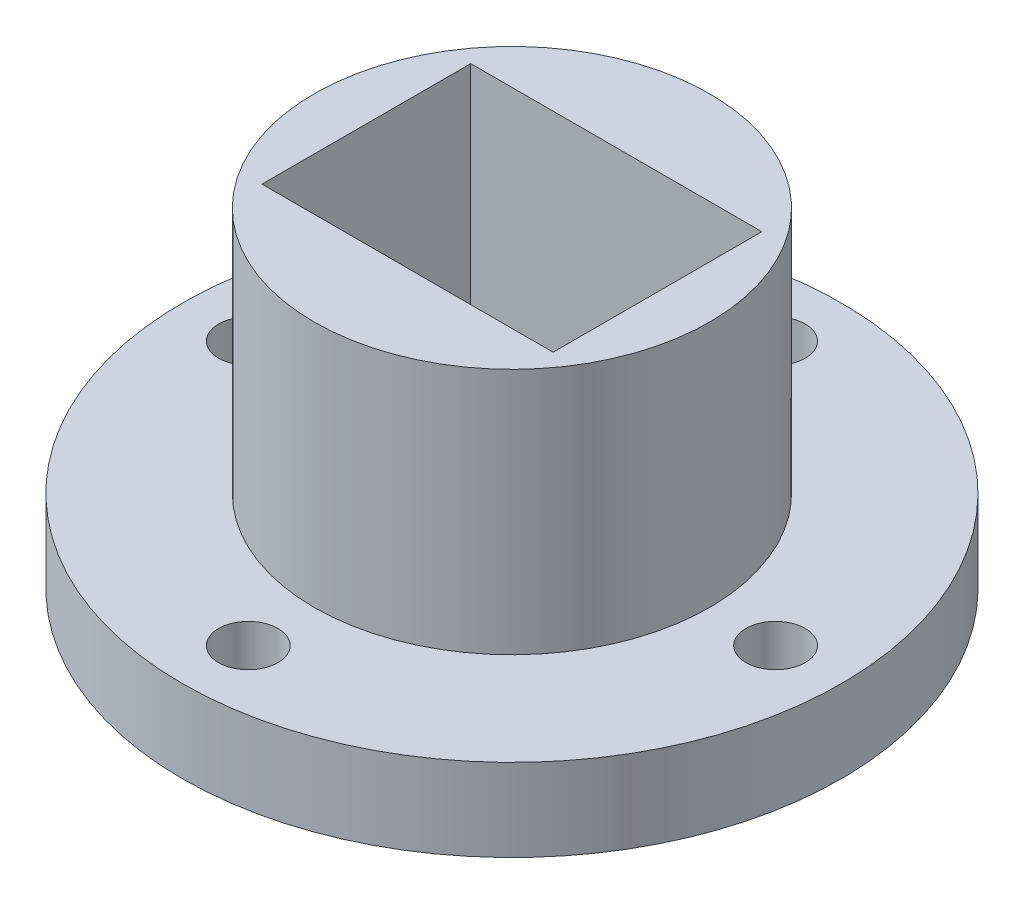
ISO-10303-21;
HEADER;
FILE_DESCRIPTION(('STEP AP214'),'2;1');
FILE_NAME('part.step','',(''),(''),'','','');
FILE_SCHEMA(('AUTOMOTIVE_DESIGN { 1 0 10303 214 1 1 1 1 }'));
ENDSEC;
DATA;
#1=APPLICATION_CONTEXT('core data for automotive mechanical design processes');
#2=APPLICATION_PROTOCOL_DEFINITION('international standard','automotive_design',2000,#1);
#3=PRODUCT_CONTEXT('',#1,'mechanical');
#4=PRODUCT('Part','Part','',(#3));
#5=PRODUCT_RELATED_PRODUCT_CATEGORY('part','',(#4));
#6=PRODUCT_DEFINITION_FORMATION('','',#4);
#7=PRODUCT_DEFINITION_CONTEXT('part definition',#1,'design');
#8=PRODUCT_DEFINITION('design','',#6,#7);
#9=PRODUCT_DEFINITION_SHAPE('','',#8);
#10=(LENGTH_UNIT() NAMED_UNIT(*) SI_UNIT(.MILLI.,.METRE.));
#11=(NAMED_UNIT(*) PLANE_ANGLE_UNIT() SI_UNIT($,.RADIAN.));
#12=(NAMED_UNIT(*) SI_UNIT($,.STERADIAN.) SOLID_ANGLE_UNIT());
#13=UNCERTAINTY_MEASURE_WITH_UNIT(LENGTH_MEASURE(1.E-05),#10,'distance_accuracy_value','');
#14=(GEOMETRIC_REPRESENTATION_CONTEXT(3) GLOBAL_UNCERTAINTY_ASSIGNED_CONTEXT((#13)) GLOBAL_UNIT_ASSIGNED_CONTEXT((#10,
#11,#12)) REPRESENTATION_CONTEXT('',''));
#15=CARTESIAN_POINT('',(0.,0.,0.));
#16=DIRECTION('',(0.,0.,1.));
#17=DIRECTION('',(1.,0.,0.));
#18=AXIS2_PLACEMENT_3D('',#15,#16,#17);
#19=CARTESIAN_POINT('',(0.,6.,0.));
#20=DIRECTION('',(0.,1.,0.));
#21=DIRECTION('',(0.,0.,1.));
#22=AXIS2_PLACEMENT_3D('',#19,#20,#21);
#23=PLANE('',#22);
#24=DIRECTION('',(-1.,0.,0.));
#25=VECTOR('',#24,1.);
#26=CARTESIAN_POINT('',(-2.65,6.,-1.9));
#27=LINE('',#26,#25);
#28=CARTESIAN_POINT('',(2.65,6.,-1.9));
#29=VERTEX_POINT('',#28);
#30=CARTESIAN_POINT('',(-2.65,6.,-1.9));
#31=VERTEX_POINT('',#30);
#32=EDGE_CURVE('E81',#29,#31,#27,.T.);
#33=ORIENTED_EDGE('',*,*,#32,.F.);
#34=DIRECTION('',(0.,0.,-1.));
#35=VECTOR('',#34,1.);
#36=CARTESIAN_POINT('',(2.65,6.,1.9));
#37=LINE('',#36,#35);
#38=CARTESIAN_POINT('',(2.65,6.,1.9));
#39=VERTEX_POINT('',#38);
#40=EDGE_CURVE('E74',#39,#29,#37,.T.);
#41=ORIENTED_EDGE('',*,*,#40,.F.);
#42=DIRECTION('',(1.,0.,0.));
#43=VECTOR('',#42,1.);
#44=CARTESIAN_POINT('',(-2.65,6.,1.9));
#45=LINE('',#44,#43);
#46=CARTESIAN_POINT('',(-2.65,6.,1.9));
#47=VERTEX_POINT('',#46);
#48=EDGE_CURVE('E94',#47,#39,#45,.T.);
#49=ORIENTED_EDGE('',*,*,#48,.F.);
#50=DIRECTION('',(0.,0.,1.));
#51=VECTOR('',#50,1.);
#52=CARTESIAN_POINT('',(-2.65,6.,1.9));
#53=LINE('',#52,#51);
#54=EDGE_CURVE('E92',#31,#47,#53,.T.);
#55=ORIENTED_EDGE('',*,*,#54,.F.);
#56=EDGE_LOOP('',(#33,#41,#49,#55));
#57=FACE_BOUND('',#56,.T.);
#58=CARTESIAN_POINT('',(0.,6.,0.));
#59=DIRECTION('',(0.,1.,0.));
#60=DIRECTION('',(0.,0.,1.));
#61=AXIS2_PLACEMENT_3D('',#58,#59,#60);
#62=CIRCLE('',#61,3.6);
#63=CARTESIAN_POINT('',(0.,6.,3.6));
#64=VERTEX_POINT('',#63);
#65=EDGE_CURVE('E233',#64,#64,#62,.T.);
#66=ORIENTED_EDGE('',*,*,#65,.T.);
#67=EDGE_LOOP('',(#66));
#68=FACE_BOUND('',#67,.T.);
#69=ADVANCED_FACE('F33',(#57,#68),#23,.T.);
#70=CARTESIAN_POINT('',(0.,0.,0.));
#71=DIRECTION('',(0.,1.,0.));
#72=DIRECTION('',(0.,0.,1.));
#73=AXIS2_PLACEMENT_3D('',#70,#71,#72);
#74=PLANE('',#73);
#75=CARTESIAN_POINT('',(-4.8,0.,0.));
#76=DIRECTION('',(0.,1.,0.));
#77=DIRECTION('',(0.,0.,1.));
#78=AXIS2_PLACEMENT_3D('',#75,#76,#77);
#79=CIRCLE('',#78,0.539999999999999);
#80=CARTESIAN_POINT('',(-4.8,0.,0.539999999999999));
#81=VERTEX_POINT('',#80);
#82=EDGE_CURVE('E232',#81,#81,#79,.T.);
#83=ORIENTED_EDGE('',*,*,#82,.T.);
#84=EDGE_LOOP('',(#83));
#85=FACE_BOUND('',#84,.T.);
#86=CARTESIAN_POINT('',(0.,0.,4.8));
#87=DIRECTION('',(0.,1.,0.));
#88=DIRECTION('',(0.,0.,1.));
#89=AXIS2_PLACEMENT_3D('',#86,#87,#88);
#90=CIRCLE('',#89,0.54);
#91=CARTESIAN_POINT('',(0.,0.,5.34));
#92=VERTEX_POINT('',#91);
#93=EDGE_CURVE('E234',#92,#92,#90,.T.);
#94=ORIENTED_EDGE('',*,*,#93,.T.);
#95=EDGE_LOOP('',(#94));
#96=FACE_BOUND('',#95,.T.);
#97=CARTESIAN_POINT('',(4.8,0.,0.));
#98=DIRECTION('',(0.,1.,0.));
#99=DIRECTION('',(0.,0.,1.));
#100=AXIS2_PLACEMENT_3D('',#97,#98,#99);
#101=CIRCLE('',#100,0.539999999999999);
#102=CARTESIAN_POINT('',(4.8,0.,0.539999999999999));
#103=VERTEX_POINT('',#102);
#104=EDGE_CURVE('E240',#103,#103,#101,.T.);
#105=ORIENTED_EDGE('',*,*,#104,.T.);
#106=EDGE_LOOP('',(#105));
#107=FACE_BOUND('',#106,.T.);
#108=CARTESIAN_POINT('',(0.,0.,-4.8));
#109=DIRECTION('',(0.,1.,0.));
#110=DIRECTION('',(0.,0.,1.));
#111=AXIS2_PLACEMENT_3D('',#108,#109,#110);
#112=CIRCLE('',#111,0.54);
#113=CARTESIAN_POINT('',(0.,0.,-4.26));
#114=VERTEX_POINT('',#113);
#115=EDGE_CURVE('E256',#114,#114,#112,.T.);
#116=ORIENTED_EDGE('',*,*,#115,.T.);
#117=EDGE_LOOP('',(#116));
#118=FACE_BOUND('',#117,.T.);
#119=CARTESIAN_POINT('',(0.,0.,0.));
#120=DIRECTION('',(0.,1.,0.));
#121=DIRECTION('',(0.,0.,1.));
#122=AXIS2_PLACEMENT_3D('',#119,#120,#121);
#123=CIRCLE('',#122,6.);
#124=CARTESIAN_POINT('',(0.,0.,6.));
#125=VERTEX_POINT('',#124);
#126=EDGE_CURVE('E11',#125,#125,#123,.T.);
#127=ORIENTED_EDGE('',*,*,#126,.F.);
#128=EDGE_LOOP('',(#127));
#129=FACE_BOUND('',#128,.T.);
#130=DIRECTION('',(0.,0.,-1.));
#131=VECTOR('',#130,1.);
#132=CARTESIAN_POINT('',(2.65,0.,1.9));
#133=LINE('',#132,#131);
#134=CARTESIAN_POINT('',(2.65,0.,1.9));
#135=VERTEX_POINT('',#134);
#136=CARTESIAN_POINT('',(2.65,0.,-1.9));
#137=VERTEX_POINT('',#136);
#138=EDGE_CURVE('E56',#135,#137,#133,.T.);
#139=ORIENTED_EDGE('',*,*,#138,.T.);
#140=DIRECTION('',(-1.,0.,0.));
#141=VECTOR('',#140,1.);
#142=CARTESIAN_POINT('',(-2.65,0.,-1.9));
#143=LINE('',#142,#141);
#144=CARTESIAN_POINT('',(-2.65,0.,-1.9));
#145=VERTEX_POINT('',#144);
#146=EDGE_CURVE('E88',#137,#145,#143,.T.);
#147=ORIENTED_EDGE('',*,*,#146,.T.);
#148=DIRECTION('',(0.,0.,1.));
#149=VECTOR('',#148,1.);
#150=CARTESIAN_POINT('',(-2.65,0.,1.9));
#151=LINE('',#150,#149);
#152=CARTESIAN_POINT('',(-2.65,0.,1.9));
#153=VERTEX_POINT('',#152);
#154=EDGE_CURVE('E102',#145,#153,#151,.T.);
#155=ORIENTED_EDGE('',*,*,#154,.T.);
#156=DIRECTION('',(1.,0.,0.));
#157=VECTOR('',#156,1.);
#158=CARTESIAN_POINT('',(-2.65,0.,1.9));
#159=LINE('',#158,#157);
#160=EDGE_CURVE('E82',#153,#135,#159,.T.);
#161=ORIENTED_EDGE('',*,*,#160,.T.);
#162=EDGE_LOOP('',(#139,#147,#155,#161));
#163=FACE_BOUND('',#162,.T.);
#164=ADVANCED_FACE('F113',(#85,#96,#107,#118,#129,#163),#74,.F.);
#165=CARTESIAN_POINT('',(0.,6.,0.));
#166=DIRECTION('',(0.,-1.,0.));
#167=DIRECTION('',(0.,0.,-1.));
#168=AXIS2_PLACEMENT_3D('',#165,#166,#167);
#169=CYLINDRICAL_SURFACE('',#168,6.);
#170=CARTESIAN_POINT('',(0.,1.5,0.));
#171=DIRECTION('',(0.,1.,0.));
#172=DIRECTION('',(0.,0.,1.));
#173=AXIS2_PLACEMENT_3D('',#170,#171,#172);
#174=CIRCLE('',#173,6.);
#175=CARTESIAN_POINT('',(0.,1.5,6.));
#176=VERTEX_POINT('',#175);
#177=EDGE_CURVE('E100',#176,#176,#174,.T.);
#178=ORIENTED_EDGE('',*,*,#177,.F.);
#179=EDGE_LOOP('',(#178));
#180=FACE_BOUND('',#179,.T.);
#181=ORIENTED_EDGE('',*,*,#126,.T.);
#182=EDGE_LOOP('',(#181));
#183=FACE_BOUND('',#182,.T.);
#184=ADVANCED_FACE('F35',(#180,#183),#169,.T.);
#185=CARTESIAN_POINT('',(2.65,6.,1.9));
#186=DIRECTION('',(-1.,0.,0.));
#187=DIRECTION('',(0.,0.,1.));
#188=AXIS2_PLACEMENT_3D('',#185,#186,#187);
#189=PLANE('',#188);
#190=ORIENTED_EDGE('',*,*,#138,.F.);
#191=DIRECTION('',(0.,-1.,0.));
#192=VECTOR('',#191,1.);
#193=CARTESIAN_POINT('',(2.65,6.,1.9));
#194=LINE('',#193,#192);
#195=EDGE_CURVE('E77',#39,#135,#194,.T.);
#196=ORIENTED_EDGE('',*,*,#195,.F.);
#197=ORIENTED_EDGE('',*,*,#40,.T.);
#198=DIRECTION('',(0.,-1.,0.));
#199=VECTOR('',#198,1.);
#200=CARTESIAN_POINT('',(2.65,6.,-1.9));
#201=LINE('',#200,#199);
#202=EDGE_CURVE('E41',#29,#137,#201,.T.);
#203=ORIENTED_EDGE('',*,*,#202,.T.);
#204=EDGE_LOOP('',(#190,#196,#197,#203));
#205=FACE_BOUND('',#204,.T.);
#206=ADVANCED_FACE('F76',(#205),#189,.T.);
#207=CARTESIAN_POINT('',(-2.65,6.,-1.9));
#208=DIRECTION('',(0.,0.,1.));
#209=DIRECTION('',(1.,0.,0.));
#210=AXIS2_PLACEMENT_3D('',#207,#208,#209);
#211=PLANE('',#210);
#212=ORIENTED_EDGE('',*,*,#146,.F.);
#213=ORIENTED_EDGE('',*,*,#202,.F.);
#214=ORIENTED_EDGE('',*,*,#32,.T.);
#215=DIRECTION('',(0.,-1.,0.));
#216=VECTOR('',#215,1.);
#217=CARTESIAN_POINT('',(-2.65,6.,-1.9));
#218=LINE('',#217,#216);
#219=EDGE_CURVE('E89',#31,#145,#218,.T.);
#220=ORIENTED_EDGE('',*,*,#219,.T.);
#221=EDGE_LOOP('',(#212,#213,#214,#220));
#222=FACE_BOUND('',#221,.T.);
#223=ADVANCED_FACE('F85',(#222),#211,.T.);
#224=CARTESIAN_POINT('',(-2.65,6.,1.9));
#225=DIRECTION('',(1.,0.,0.));
#226=DIRECTION('',(0.,0.,-1.));
#227=AXIS2_PLACEMENT_3D('',#224,#225,#226);
#228=PLANE('',#227);
#229=ORIENTED_EDGE('',*,*,#154,.F.);
#230=ORIENTED_EDGE('',*,*,#219,.F.);
#231=ORIENTED_EDGE('',*,*,#54,.T.);
#232=DIRECTION('',(0.,-1.,0.));
#233=VECTOR('',#232,1.);
#234=CARTESIAN_POINT('',(-2.65,6.,1.9));
#235=LINE('',#234,#233);
#236=EDGE_CURVE('E48',#47,#153,#235,.T.);
#237=ORIENTED_EDGE('',*,*,#236,.T.);
#238=EDGE_LOOP('',(#229,#230,#231,#237));
#239=FACE_BOUND('',#238,.T.);
#240=ADVANCED_FACE('F111',(#239),#228,.T.);
#241=CARTESIAN_POINT('',(-2.65,6.,1.9));
#242=DIRECTION('',(0.,0.,-1.));
#243=DIRECTION('',(-1.,0.,0.));
#244=AXIS2_PLACEMENT_3D('',#241,#242,#243);
#245=PLANE('',#244);
#246=ORIENTED_EDGE('',*,*,#160,.F.);
#247=ORIENTED_EDGE('',*,*,#236,.F.);
#248=ORIENTED_EDGE('',*,*,#48,.T.);
#249=ORIENTED_EDGE('',*,*,#195,.T.);
#250=EDGE_LOOP('',(#246,#247,#248,#249));
#251=FACE_BOUND('',#250,.T.);
#252=ADVANCED_FACE('F114',(#251),#245,.T.);
#253=CARTESIAN_POINT('',(0.,1.5,6.));
#254=DIRECTION('',(0.,-1.,0.));
#255=DIRECTION('',(0.,0.,-1.));
#256=AXIS2_PLACEMENT_3D('',#253,#254,#255);
#257=PLANE('',#256);
#258=CARTESIAN_POINT('',(-4.8,1.5,0.));
#259=DIRECTION('',(0.,1.,0.));
#260=DIRECTION('',(0.,0.,1.));
#261=AXIS2_PLACEMENT_3D('',#258,#259,#260);
#262=CIRCLE('',#261,0.539999999999999);
#263=CARTESIAN_POINT('',(-4.8,1.5,0.539999999999999));
#264=VERTEX_POINT('',#263);
#265=EDGE_CURVE('E229',#264,#264,#262,.T.);
#266=ORIENTED_EDGE('',*,*,#265,.F.);
#267=EDGE_LOOP('',(#266));
#268=FACE_BOUND('',#267,.T.);
#269=CARTESIAN_POINT('',(0.,1.5,4.8));
#270=DIRECTION('',(0.,1.,0.));
#271=DIRECTION('',(0.,0.,1.));
#272=AXIS2_PLACEMENT_3D('',#269,#270,#271);
#273=CIRCLE('',#272,0.54);
#274=CARTESIAN_POINT('',(0.,1.5,5.34));
#275=VERTEX_POINT('',#274);
#276=EDGE_CURVE('E265',#275,#275,#273,.T.);
#277=ORIENTED_EDGE('',*,*,#276,.F.);
#278=EDGE_LOOP('',(#277));
#279=FACE_BOUND('',#278,.T.);
#280=CARTESIAN_POINT('',(4.8,1.5,0.));
#281=DIRECTION('',(0.,1.,0.));
#282=DIRECTION('',(0.,0.,1.));
#283=AXIS2_PLACEMENT_3D('',#280,#281,#282);
#284=CIRCLE('',#283,0.539999999999999);
#285=CARTESIAN_POINT('',(4.8,1.5,0.539999999999999));
#286=VERTEX_POINT('',#285);
#287=EDGE_CURVE('E262',#286,#286,#284,.T.);
#288=ORIENTED_EDGE('',*,*,#287,.F.);
#289=EDGE_LOOP('',(#288));
#290=FACE_BOUND('',#289,.T.);
#291=CARTESIAN_POINT('',(0.,1.5,-4.8));
#292=DIRECTION('',(0.,1.,0.));
#293=DIRECTION('',(0.,0.,1.));
#294=AXIS2_PLACEMENT_3D('',#291,#292,#293);
#295=CIRCLE('',#294,0.54);
#296=CARTESIAN_POINT('',(0.,1.5,-4.26));
#297=VERTEX_POINT('',#296);
#298=EDGE_CURVE('E259',#297,#297,#295,.T.);
#299=ORIENTED_EDGE('',*,*,#298,.F.);
#300=EDGE_LOOP('',(#299));
#301=FACE_BOUND('',#300,.T.);
#302=CARTESIAN_POINT('',(0.,1.5,0.));
#303=DIRECTION('',(0.,1.,0.));
#304=DIRECTION('',(0.,0.,1.));
#305=AXIS2_PLACEMENT_3D('',#302,#303,#304);
#306=CIRCLE('',#305,3.6);
#307=CARTESIAN_POINT('',(0.,1.5,3.6));
#308=VERTEX_POINT('',#307);
#309=EDGE_CURVE('E237',#308,#308,#306,.T.);
#310=ORIENTED_EDGE('',*,*,#309,.F.);
#311=EDGE_LOOP('',(#310));
#312=FACE_BOUND('',#311,.T.);
#313=ORIENTED_EDGE('',*,*,#177,.T.);
#314=EDGE_LOOP('',(#313));
#315=FACE_BOUND('',#314,.T.);
#316=ADVANCED_FACE('F116',(#268,#279,#290,#301,#312,#315),#257,.F.);
#317=CARTESIAN_POINT('',(0.,6.,0.));
#318=DIRECTION('',(0.,1.,0.));
#319=DIRECTION('',(0.,0.,1.));
#320=AXIS2_PLACEMENT_3D('',#317,#318,#319);
#321=CYLINDRICAL_SURFACE('',#320,3.6);
#322=ORIENTED_EDGE('',*,*,#65,.F.);
#323=EDGE_LOOP('',(#322));
#324=FACE_BOUND('',#323,.T.);
#325=ORIENTED_EDGE('',*,*,#309,.T.);
#326=EDGE_LOOP('',(#325));
#327=FACE_BOUND('',#326,.T.);
#328=ADVANCED_FACE('F122',(#324,#327),#321,.T.);
#329=CARTESIAN_POINT('',(0.,-58.5,-4.8));
#330=DIRECTION('',(0.,1.,0.));
#331=DIRECTION('',(0.,0.,1.));
#332=AXIS2_PLACEMENT_3D('',#329,#330,#331);
#333=CYLINDRICAL_SURFACE('',#332,0.54);
#334=ORIENTED_EDGE('',*,*,#298,.T.);
#335=EDGE_LOOP('',(#334));
#336=FACE_BOUND('',#335,.T.);
#337=ORIENTED_EDGE('',*,*,#115,.F.);
#338=EDGE_LOOP('',(#337));
#339=FACE_BOUND('',#338,.T.);
#340=ADVANCED_FACE('F172',(#336,#339),#333,.F.);
#341=CARTESIAN_POINT('',(4.8,-58.5,0.));
#342=DIRECTION('',(0.,1.,0.));
#343=DIRECTION('',(0.,0.,1.));
#344=AXIS2_PLACEMENT_3D('',#341,#342,#343);
#345=CYLINDRICAL_SURFACE('',#344,0.539999999999999);
#346=ORIENTED_EDGE('',*,*,#287,.T.);
#347=EDGE_LOOP('',(#346));
#348=FACE_BOUND('',#347,.T.);
#349=ORIENTED_EDGE('',*,*,#104,.F.);
#350=EDGE_LOOP('',(#349));
#351=FACE_BOUND('',#350,.T.);
#352=ADVANCED_FACE('F192',(#348,#351),#345,.F.);
#353=CARTESIAN_POINT('',(0.,-58.5,4.8));
#354=DIRECTION('',(0.,1.,0.));
#355=DIRECTION('',(0.,0.,1.));
#356=AXIS2_PLACEMENT_3D('',#353,#354,#355);
#357=CYLINDRICAL_SURFACE('',#356,0.54);
#358=ORIENTED_EDGE('',*,*,#276,.T.);
#359=EDGE_LOOP('',(#358));
#360=FACE_BOUND('',#359,.T.);
#361=ORIENTED_EDGE('',*,*,#93,.F.);
#362=EDGE_LOOP('',(#361));
#363=FACE_BOUND('',#362,.T.);
#364=ADVANCED_FACE('F202',(#360,#363),#357,.F.);
#365=CARTESIAN_POINT('',(-4.8,-58.5,0.));
#366=DIRECTION('',(0.,1.,0.));
#367=DIRECTION('',(0.,0.,1.));
#368=AXIS2_PLACEMENT_3D('',#365,#366,#367);
#369=CYLINDRICAL_SURFACE('',#368,0.539999999999999);
#370=ORIENTED_EDGE('',*,*,#265,.T.);
#371=EDGE_LOOP('',(#370));
#372=FACE_BOUND('',#371,.T.);
#373=ORIENTED_EDGE('',*,*,#82,.F.);
#374=EDGE_LOOP('',(#373));
#375=FACE_BOUND('',#374,.T.);
#376=ADVANCED_FACE('F212',(#372,#375),#369,.F.);
#377=CLOSED_SHELL('',(#69,#164,#184,#206,#223,#240,#252,#316,#328,#340,#352,#364,#376));
#378=MANIFOLD_SOLID_BREP('B2',#377);
#379=ADVANCED_BREP_SHAPE_REPRESENTATION('',(#18,#378),#14);
#380=SHAPE_DEFINITION_REPRESENTATION(#9,#379);
ENDSEC;
END-ISO-10303-21;
